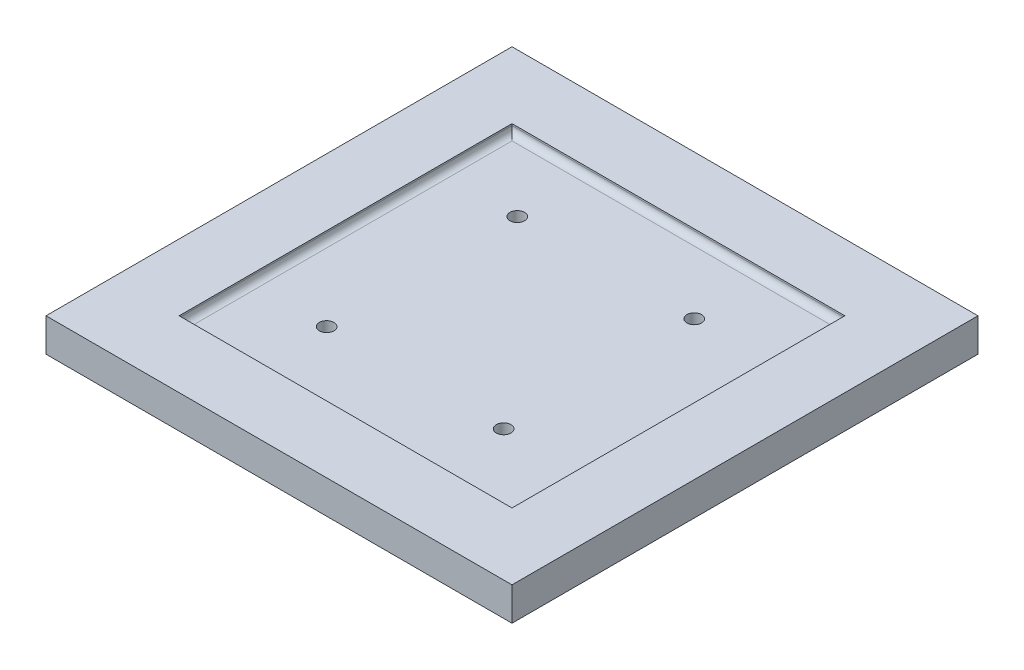
ISO-10303-21;
HEADER;
FILE_DESCRIPTION(('STEP AP214'),'2;1');
FILE_NAME('part.step','',(''),(''),'','','');
FILE_SCHEMA(('AUTOMOTIVE_DESIGN { 1 0 10303 214 1 1 1 1 }'));
ENDSEC;
DATA;
#1=APPLICATION_CONTEXT('core data for automotive mechanical design processes');
#2=APPLICATION_PROTOCOL_DEFINITION('international standard','automotive_design',2000,#1);
#3=PRODUCT_CONTEXT('',#1,'mechanical');
#4=PRODUCT('Part','Part','',(#3));
#5=PRODUCT_RELATED_PRODUCT_CATEGORY('part','',(#4));
#6=PRODUCT_DEFINITION_FORMATION('','',#4);
#7=PRODUCT_DEFINITION_CONTEXT('part definition',#1,'design');
#8=PRODUCT_DEFINITION('design','',#6,#7);
#9=PRODUCT_DEFINITION_SHAPE('','',#8);
#10=(LENGTH_UNIT() NAMED_UNIT(*) SI_UNIT(.MILLI.,.METRE.));
#11=(NAMED_UNIT(*) PLANE_ANGLE_UNIT() SI_UNIT($,.RADIAN.));
#12=(NAMED_UNIT(*) SI_UNIT($,.STERADIAN.) SOLID_ANGLE_UNIT());
#13=UNCERTAINTY_MEASURE_WITH_UNIT(LENGTH_MEASURE(1.E-05),#10,'distance_accuracy_value','');
#14=(GEOMETRIC_REPRESENTATION_CONTEXT(3) GLOBAL_UNCERTAINTY_ASSIGNED_CONTEXT((#13)) GLOBAL_UNIT_ASSIGNED_CONTEXT((#10,
#11,#12)) REPRESENTATION_CONTEXT('',''));
#15=CARTESIAN_POINT('',(0.,0.,0.));
#16=DIRECTION('',(0.,0.,1.));
#17=DIRECTION('',(1.,0.,0.));
#18=AXIS2_PLACEMENT_3D('',#15,#16,#17);
#19=CARTESIAN_POINT('',(88.9,12.7,-88.9));
#20=DIRECTION('',(0.,0.,1.));
#21=DIRECTION('',(1.,0.,0.));
#22=AXIS2_PLACEMENT_3D('',#19,#20,#21);
#23=PLANE('',#22);
#24=DIRECTION('',(-1.,0.,0.));
#25=VECTOR('',#24,1.);
#26=CARTESIAN_POINT('',(88.9,0.,-88.9));
#27=LINE('',#26,#25);
#28=CARTESIAN_POINT('',(88.9,0.,-88.9));
#29=VERTEX_POINT('',#28);
#30=CARTESIAN_POINT('',(-88.9,0.,-88.9));
#31=VERTEX_POINT('',#30);
#32=EDGE_CURVE('E215',#29,#31,#27,.T.);
#33=ORIENTED_EDGE('',*,*,#32,.T.);
#34=DIRECTION('',(0.,-1.,0.));
#35=VECTOR('',#34,1.);
#36=CARTESIAN_POINT('',(-88.9,12.7,-88.9));
#37=LINE('',#36,#35);
#38=CARTESIAN_POINT('',(-88.9,12.7,-88.9));
#39=VERTEX_POINT('',#38);
#40=EDGE_CURVE('E262',#39,#31,#37,.T.);
#41=ORIENTED_EDGE('',*,*,#40,.F.);
#42=DIRECTION('',(-1.,0.,0.));
#43=VECTOR('',#42,1.);
#44=CARTESIAN_POINT('',(88.9,12.7,-88.9));
#45=LINE('',#44,#43);
#46=CARTESIAN_POINT('',(88.9,12.7,-88.9));
#47=VERTEX_POINT('',#46);
#48=EDGE_CURVE('E224',#47,#39,#45,.T.);
#49=ORIENTED_EDGE('',*,*,#48,.F.);
#50=DIRECTION('',(0.,-1.,0.));
#51=VECTOR('',#50,1.);
#52=CARTESIAN_POINT('',(88.9,12.7,-88.9));
#53=LINE('',#52,#51);
#54=EDGE_CURVE('E239',#47,#29,#53,.T.);
#55=ORIENTED_EDGE('',*,*,#54,.T.);
#56=EDGE_LOOP('',(#33,#41,#49,#55));
#57=FACE_BOUND('',#56,.T.);
#58=ADVANCED_FACE('F40',(#57),#23,.F.);
#59=CARTESIAN_POINT('',(-88.9,12.7,88.9));
#60=DIRECTION('',(-1.,0.,0.));
#61=DIRECTION('',(0.,0.,1.));
#62=AXIS2_PLACEMENT_3D('',#59,#60,#61);
#63=PLANE('',#62);
#64=DIRECTION('',(0.,0.,-1.));
#65=VECTOR('',#64,1.);
#66=CARTESIAN_POINT('',(-88.9,0.,88.9));
#67=LINE('',#66,#65);
#68=CARTESIAN_POINT('',(-88.9,0.,88.9));
#69=VERTEX_POINT('',#68);
#70=EDGE_CURVE('E243',#69,#31,#67,.T.);
#71=ORIENTED_EDGE('',*,*,#70,.F.);
#72=DIRECTION('',(0.,-1.,0.));
#73=VECTOR('',#72,1.);
#74=CARTESIAN_POINT('',(-88.9,12.7,88.9));
#75=LINE('',#74,#73);
#76=CARTESIAN_POINT('',(-88.9,12.7,88.9));
#77=VERTEX_POINT('',#76);
#78=EDGE_CURVE('E259',#77,#69,#75,.T.);
#79=ORIENTED_EDGE('',*,*,#78,.F.);
#80=DIRECTION('',(0.,0.,-1.));
#81=VECTOR('',#80,1.);
#82=CARTESIAN_POINT('',(-88.9,12.7,88.9));
#83=LINE('',#82,#81);
#84=EDGE_CURVE('E227',#77,#39,#83,.T.);
#85=ORIENTED_EDGE('',*,*,#84,.T.);
#86=ORIENTED_EDGE('',*,*,#40,.T.);
#87=EDGE_LOOP('',(#71,#79,#85,#86));
#88=FACE_BOUND('',#87,.T.);
#89=ADVANCED_FACE('F394',(#88),#63,.T.);
#90=CARTESIAN_POINT('',(88.9,12.7,88.9));
#91=DIRECTION('',(0.,0.,1.));
#92=DIRECTION('',(1.,0.,0.));
#93=AXIS2_PLACEMENT_3D('',#90,#91,#92);
#94=PLANE('',#93);
#95=DIRECTION('',(-1.,0.,0.));
#96=VECTOR('',#95,1.);
#97=CARTESIAN_POINT('',(88.9,0.,88.9));
#98=LINE('',#97,#96);
#99=CARTESIAN_POINT('',(88.9,0.,88.9));
#100=VERTEX_POINT('',#99);
#101=EDGE_CURVE('E247',#100,#69,#98,.T.);
#102=ORIENTED_EDGE('',*,*,#101,.F.);
#103=DIRECTION('',(0.,-1.,0.));
#104=VECTOR('',#103,1.);
#105=CARTESIAN_POINT('',(88.9,12.7,88.9));
#106=LINE('',#105,#104);
#107=CARTESIAN_POINT('',(88.9,12.7,88.9));
#108=VERTEX_POINT('',#107);
#109=EDGE_CURVE('E256',#108,#100,#106,.T.);
#110=ORIENTED_EDGE('',*,*,#109,.F.);
#111=DIRECTION('',(-1.,0.,0.));
#112=VECTOR('',#111,1.);
#113=CARTESIAN_POINT('',(88.9,12.7,88.9));
#114=LINE('',#113,#112);
#115=EDGE_CURVE('E232',#108,#77,#114,.T.);
#116=ORIENTED_EDGE('',*,*,#115,.T.);
#117=ORIENTED_EDGE('',*,*,#78,.T.);
#118=EDGE_LOOP('',(#102,#110,#116,#117));
#119=FACE_BOUND('',#118,.T.);
#120=ADVANCED_FACE('F400',(#119),#94,.T.);
#121=CARTESIAN_POINT('',(88.9,12.7,88.9));
#122=DIRECTION('',(-1.,0.,0.));
#123=DIRECTION('',(0.,0.,1.));
#124=AXIS2_PLACEMENT_3D('',#121,#122,#123);
#125=PLANE('',#124);
#126=DIRECTION('',(0.,0.,-1.));
#127=VECTOR('',#126,1.);
#128=CARTESIAN_POINT('',(88.9,0.,88.9));
#129=LINE('',#128,#127);
#130=EDGE_CURVE('E228',#100,#29,#129,.T.);
#131=ORIENTED_EDGE('',*,*,#130,.T.);
#132=ORIENTED_EDGE('',*,*,#54,.F.);
#133=DIRECTION('',(0.,0.,-1.));
#134=VECTOR('',#133,1.);
#135=CARTESIAN_POINT('',(88.9,12.7,88.9));
#136=LINE('',#135,#134);
#137=EDGE_CURVE('E236',#108,#47,#136,.T.);
#138=ORIENTED_EDGE('',*,*,#137,.F.);
#139=ORIENTED_EDGE('',*,*,#109,.T.);
#140=EDGE_LOOP('',(#131,#132,#138,#139));
#141=FACE_BOUND('',#140,.T.);
#142=ADVANCED_FACE('F591',(#141),#125,.F.);
#143=CARTESIAN_POINT('',(0.,12.7,0.));
#144=DIRECTION('',(0.,-1.,0.));
#145=DIRECTION('',(0.,0.,-1.));
#146=AXIS2_PLACEMENT_3D('',#143,#144,#145);
#147=PLANE('',#146);
#148=DIRECTION('',(1.,0.,0.));
#149=VECTOR('',#148,1.);
#150=CARTESIAN_POINT('',(63.5,12.7,63.5));
#151=LINE('',#150,#149);
#152=CARTESIAN_POINT('',(-63.5,12.7,63.5));
#153=VERTEX_POINT('',#152);
#154=CARTESIAN_POINT('',(63.5,12.7,63.5));
#155=VERTEX_POINT('',#154);
#156=EDGE_CURVE('E199',#153,#155,#151,.T.);
#157=ORIENTED_EDGE('',*,*,#156,.F.);
#158=DIRECTION('',(0.,0.,1.));
#159=VECTOR('',#158,1.);
#160=CARTESIAN_POINT('',(-63.5,12.7,63.5));
#161=LINE('',#160,#159);
#162=CARTESIAN_POINT('',(-63.5,12.7,-63.5));
#163=VERTEX_POINT('',#162);
#164=EDGE_CURVE('E191',#163,#153,#161,.T.);
#165=ORIENTED_EDGE('',*,*,#164,.F.);
#166=DIRECTION('',(-1.,0.,0.));
#167=VECTOR('',#166,1.);
#168=CARTESIAN_POINT('',(63.5,12.7,-63.5));
#169=LINE('',#168,#167);
#170=CARTESIAN_POINT('',(63.5,12.7,-63.5));
#171=VERTEX_POINT('',#170);
#172=EDGE_CURVE('E207',#171,#163,#169,.T.);
#173=ORIENTED_EDGE('',*,*,#172,.F.);
#174=DIRECTION('',(0.,0.,-1.));
#175=VECTOR('',#174,1.);
#176=CARTESIAN_POINT('',(63.5,12.7,63.5));
#177=LINE('',#176,#175);
#178=EDGE_CURVE('E203',#155,#171,#177,.T.);
#179=ORIENTED_EDGE('',*,*,#178,.F.);
#180=EDGE_LOOP('',(#157,#165,#173,#179));
#181=FACE_BOUND('',#180,.T.);
#182=ORIENTED_EDGE('',*,*,#48,.T.);
#183=ORIENTED_EDGE('',*,*,#84,.F.);
#184=ORIENTED_EDGE('',*,*,#115,.F.);
#185=ORIENTED_EDGE('',*,*,#137,.T.);
#186=EDGE_LOOP('',(#182,#183,#184,#185));
#187=FACE_BOUND('',#186,.T.);
#188=ADVANCED_FACE('F583',(#181,#187),#147,.F.);
#189=CARTESIAN_POINT('',(0.,0.,0.));
#190=DIRECTION('',(0.,-1.,0.));
#191=DIRECTION('',(0.,0.,-1.));
#192=AXIS2_PLACEMENT_3D('',#189,#190,#191);
#193=PLANE('',#192);
#194=DIRECTION('',(0.,0.,1.));
#195=VECTOR('',#194,1.);
#196=CARTESIAN_POINT('',(63.5,0.,63.5));
#197=LINE('',#196,#195);
#198=CARTESIAN_POINT('',(63.5,0.,-63.5));
#199=VERTEX_POINT('',#198);
#200=CARTESIAN_POINT('',(63.5,0.,63.5));
#201=VERTEX_POINT('',#200);
#202=EDGE_CURVE('E176',#199,#201,#197,.T.);
#203=ORIENTED_EDGE('',*,*,#202,.F.);
#204=DIRECTION('',(1.,0.,0.));
#205=VECTOR('',#204,1.);
#206=CARTESIAN_POINT('',(-63.5,0.,-63.5));
#207=LINE('',#206,#205);
#208=CARTESIAN_POINT('',(-63.5,0.,-63.5));
#209=VERTEX_POINT('',#208);
#210=EDGE_CURVE('E181',#209,#199,#207,.T.);
#211=ORIENTED_EDGE('',*,*,#210,.F.);
#212=DIRECTION('',(0.,0.,-1.));
#213=VECTOR('',#212,1.);
#214=CARTESIAN_POINT('',(-63.5,0.,63.5));
#215=LINE('',#214,#213);
#216=CARTESIAN_POINT('',(-63.5,0.,63.5));
#217=VERTEX_POINT('',#216);
#218=EDGE_CURVE('E158',#217,#209,#215,.T.);
#219=ORIENTED_EDGE('',*,*,#218,.F.);
#220=DIRECTION('',(-1.,0.,0.));
#221=VECTOR('',#220,1.);
#222=CARTESIAN_POINT('',(-63.5,0.,63.5));
#223=LINE('',#222,#221);
#224=EDGE_CURVE('E170',#201,#217,#223,.T.);
#225=ORIENTED_EDGE('',*,*,#224,.F.);
#226=EDGE_LOOP('',(#203,#211,#219,#225));
#227=FACE_BOUND('',#226,.T.);
#228=ORIENTED_EDGE('',*,*,#32,.F.);
#229=ORIENTED_EDGE('',*,*,#130,.F.);
#230=ORIENTED_EDGE('',*,*,#101,.T.);
#231=ORIENTED_EDGE('',*,*,#70,.T.);
#232=EDGE_LOOP('',(#228,#229,#230,#231));
#233=FACE_BOUND('',#232,.T.);
#234=ADVANCED_FACE('F178',(#227,#233),#193,.T.);
#235=CARTESIAN_POINT('',(-63.5,9.525,63.5));
#236=DIRECTION('',(-1.,0.,0.));
#237=DIRECTION('',(0.,0.,1.));
#238=AXIS2_PLACEMENT_3D('',#235,#236,#237);
#239=PLANE('',#238);
#240=DIRECTION('',(0.,1.,0.));
#241=VECTOR('',#240,1.);
#242=CARTESIAN_POINT('',(-63.5,9.525,63.5));
#243=LINE('',#242,#241);
#244=CARTESIAN_POINT('',(-63.5,12.065,63.5));
#245=VERTEX_POINT('',#244);
#246=EDGE_CURVE('E211',#245,#153,#243,.T.);
#247=ORIENTED_EDGE('',*,*,#246,.F.);
#248=DIRECTION('',(0.,0.,1.));
#249=VECTOR('',#248,1.);
#250=CARTESIAN_POINT('',(-63.5,12.065,63.5));
#251=LINE('',#250,#249);
#252=CARTESIAN_POINT('',(-63.5,12.065,-63.5));
#253=VERTEX_POINT('',#252);
#254=EDGE_CURVE('E278',#245,#253,#251,.F.);
#255=ORIENTED_EDGE('',*,*,#254,.T.);
#256=DIRECTION('',(0.,1.,0.));
#257=VECTOR('',#256,1.);
#258=CARTESIAN_POINT('',(-63.5,9.525,-63.5));
#259=LINE('',#258,#257);
#260=EDGE_CURVE('E212',#253,#163,#259,.T.);
#261=ORIENTED_EDGE('',*,*,#260,.T.);
#262=ORIENTED_EDGE('',*,*,#164,.T.);
#263=EDGE_LOOP('',(#247,#255,#261,#262));
#264=FACE_BOUND('',#263,.T.);
#265=ADVANCED_FACE('F566',(#264),#239,.F.);
#266=CARTESIAN_POINT('',(63.5,9.525,-63.5));
#267=DIRECTION('',(0.,0.,-1.));
#268=DIRECTION('',(-1.,0.,0.));
#269=AXIS2_PLACEMENT_3D('',#266,#267,#268);
#270=PLANE('',#269);
#271=ORIENTED_EDGE('',*,*,#260,.F.);
#272=DIRECTION('',(-1.,0.,0.));
#273=VECTOR('',#272,1.);
#274=CARTESIAN_POINT('',(63.5,12.065,-63.5));
#275=LINE('',#274,#273);
#276=CARTESIAN_POINT('',(63.5,12.065,-63.5));
#277=VERTEX_POINT('',#276);
#278=EDGE_CURVE('E285',#253,#277,#275,.F.);
#279=ORIENTED_EDGE('',*,*,#278,.T.);
#280=DIRECTION('',(0.,1.,0.));
#281=VECTOR('',#280,1.);
#282=CARTESIAN_POINT('',(63.5,9.525,-63.5));
#283=LINE('',#282,#281);
#284=EDGE_CURVE('E216',#277,#171,#283,.T.);
#285=ORIENTED_EDGE('',*,*,#284,.T.);
#286=ORIENTED_EDGE('',*,*,#172,.T.);
#287=EDGE_LOOP('',(#271,#279,#285,#286));
#288=FACE_BOUND('',#287,.T.);
#289=ADVANCED_FACE('F557',(#288),#270,.F.);
#290=CARTESIAN_POINT('',(63.5,9.525,63.5));
#291=DIRECTION('',(1.,0.,0.));
#292=DIRECTION('',(0.,0.,-1.));
#293=AXIS2_PLACEMENT_3D('',#290,#291,#292);
#294=PLANE('',#293);
#295=ORIENTED_EDGE('',*,*,#284,.F.);
#296=DIRECTION('',(0.,0.,-1.));
#297=VECTOR('',#296,1.);
#298=CARTESIAN_POINT('',(63.5,12.065,63.5));
#299=LINE('',#298,#297);
#300=CARTESIAN_POINT('',(63.5,12.065,63.5));
#301=VERTEX_POINT('',#300);
#302=EDGE_CURVE('E288',#277,#301,#299,.F.);
#303=ORIENTED_EDGE('',*,*,#302,.T.);
#304=DIRECTION('',(0.,1.,0.));
#305=VECTOR('',#304,1.);
#306=CARTESIAN_POINT('',(63.5,9.525,63.5));
#307=LINE('',#306,#305);
#308=EDGE_CURVE('E219',#301,#155,#307,.T.);
#309=ORIENTED_EDGE('',*,*,#308,.T.);
#310=ORIENTED_EDGE('',*,*,#178,.T.);
#311=EDGE_LOOP('',(#295,#303,#309,#310));
#312=FACE_BOUND('',#311,.T.);
#313=ADVANCED_FACE('F548',(#312),#294,.F.);
#314=CARTESIAN_POINT('',(63.5,9.525,63.5));
#315=DIRECTION('',(0.,0.,1.));
#316=DIRECTION('',(1.,0.,0.));
#317=AXIS2_PLACEMENT_3D('',#314,#315,#316);
#318=PLANE('',#317);
#319=ORIENTED_EDGE('',*,*,#308,.F.);
#320=DIRECTION('',(1.,0.,0.));
#321=VECTOR('',#320,1.);
#322=CARTESIAN_POINT('',(63.5,12.065,63.5));
#323=LINE('',#322,#321);
#324=EDGE_CURVE('E282',#301,#245,#323,.F.);
#325=ORIENTED_EDGE('',*,*,#324,.T.);
#326=ORIENTED_EDGE('',*,*,#246,.T.);
#327=ORIENTED_EDGE('',*,*,#156,.T.);
#328=EDGE_LOOP('',(#319,#325,#326,#327));
#329=FACE_BOUND('',#328,.T.);
#330=ADVANCED_FACE('F540',(#329),#318,.F.);
#331=CARTESIAN_POINT('',(0.,9.525,0.));
#332=DIRECTION('',(0.,1.,0.));
#333=DIRECTION('',(0.,0.,1.));
#334=AXIS2_PLACEMENT_3D('',#331,#332,#333);
#335=PLANE('',#334);
#336=CARTESIAN_POINT('',(32.584394023243,9.525,-36.9525917727357));
#337=DIRECTION('',(0.,1.,0.));
#338=DIRECTION('',(0.,0.,1.));
#339=AXIS2_PLACEMENT_3D('',#336,#337,#338);
#340=CIRCLE('',#339,2.794);
#341=CARTESIAN_POINT('',(32.584394023243,9.525,-34.1585917727357));
#342=VERTEX_POINT('',#341);
#343=EDGE_CURVE('E694',#342,#342,#340,.T.);
#344=ORIENTED_EDGE('',*,*,#343,.F.);
#345=EDGE_LOOP('',(#344));
#346=FACE_BOUND('',#345,.T.);
#347=CARTESIAN_POINT('',(-34.9455819959417,9.525,35.7719977863863));
#348=DIRECTION('',(0.,1.,0.));
#349=DIRECTION('',(0.,0.,1.));
#350=AXIS2_PLACEMENT_3D('',#347,#348,#349);
#351=CIRCLE('',#350,2.794);
#352=CARTESIAN_POINT('',(-34.9455819959417,9.525,38.5659977863863));
#353=VERTEX_POINT('',#352);
#354=EDGE_CURVE('E698',#353,#353,#351,.T.);
#355=ORIENTED_EDGE('',*,*,#354,.F.);
#356=EDGE_LOOP('',(#355));
#357=FACE_BOUND('',#356,.T.);
#358=CARTESIAN_POINT('',(32.584394023243,9.525,35.7719977863863));
#359=DIRECTION('',(0.,1.,0.));
#360=DIRECTION('',(0.,0.,1.));
#361=AXIS2_PLACEMENT_3D('',#358,#359,#360);
#362=CIRCLE('',#361,2.794);
#363=CARTESIAN_POINT('',(32.584394023243,9.525,38.5659977863863));
#364=VERTEX_POINT('',#363);
#365=EDGE_CURVE('E702',#364,#364,#362,.T.);
#366=ORIENTED_EDGE('',*,*,#365,.F.);
#367=EDGE_LOOP('',(#366));
#368=FACE_BOUND('',#367,.T.);
#369=CARTESIAN_POINT('',(-34.9455819959417,9.525,-36.9525917727357));
#370=DIRECTION('',(0.,1.,0.));
#371=DIRECTION('',(0.,0.,1.));
#372=AXIS2_PLACEMENT_3D('',#369,#370,#371);
#373=CIRCLE('',#372,2.794);
#374=CARTESIAN_POINT('',(-34.9455819959417,9.525,-34.1585917727357));
#375=VERTEX_POINT('',#374);
#376=EDGE_CURVE('E344',#375,#375,#373,.T.);
#377=ORIENTED_EDGE('',*,*,#376,.F.);
#378=EDGE_LOOP('',(#377));
#379=FACE_BOUND('',#378,.T.);
#380=DIRECTION('',(-1.,0.,0.));
#381=VECTOR('',#380,1.);
#382=CARTESIAN_POINT('',(0.,9.525,-60.96));
#383=LINE('',#382,#381);
#384=CARTESIAN_POINT('',(60.96,9.525,-60.96));
#385=VERTEX_POINT('',#384);
#386=CARTESIAN_POINT('',(-60.96,9.525,-60.96));
#387=VERTEX_POINT('',#386);
#388=EDGE_CURVE('E268',#385,#387,#383,.T.);
#389=ORIENTED_EDGE('',*,*,#388,.T.);
#390=DIRECTION('',(0.,0.,1.));
#391=VECTOR('',#390,1.);
#392=CARTESIAN_POINT('',(-60.96,9.525,0.));
#393=LINE('',#392,#391);
#394=CARTESIAN_POINT('',(-60.96,9.525,60.96));
#395=VERTEX_POINT('',#394);
#396=EDGE_CURVE('E274',#387,#395,#393,.T.);
#397=ORIENTED_EDGE('',*,*,#396,.T.);
#398=DIRECTION('',(1.,0.,0.));
#399=VECTOR('',#398,1.);
#400=CARTESIAN_POINT('',(0.,9.525,60.96));
#401=LINE('',#400,#399);
#402=CARTESIAN_POINT('',(60.96,9.525,60.96));
#403=VERTEX_POINT('',#402);
#404=EDGE_CURVE('E271',#395,#403,#401,.T.);
#405=ORIENTED_EDGE('',*,*,#404,.T.);
#406=DIRECTION('',(0.,0.,-1.));
#407=VECTOR('',#406,1.);
#408=CARTESIAN_POINT('',(60.96,9.525,0.));
#409=LINE('',#408,#407);
#410=EDGE_CURVE('E265',#403,#385,#409,.T.);
#411=ORIENTED_EDGE('',*,*,#410,.T.);
#412=EDGE_LOOP('',(#389,#397,#405,#411));
#413=FACE_BOUND('',#412,.T.);
#414=ADVANCED_FACE('F532',(#346,#357,#368,#379,#413),#335,.T.);
#415=CARTESIAN_POINT('',(63.5,3.175,63.5));
#416=DIRECTION('',(1.,0.,0.));
#417=DIRECTION('',(0.,0.,-1.));
#418=AXIS2_PLACEMENT_3D('',#415,#416,#417);
#419=PLANE('',#418);
#420=DIRECTION('',(0.,-1.,0.));
#421=VECTOR('',#420,1.);
#422=CARTESIAN_POINT('',(63.5,3.175,63.5));
#423=LINE('',#422,#421);
#424=CARTESIAN_POINT('',(63.5,0.635,63.5));
#425=VERTEX_POINT('',#424);
#426=EDGE_CURVE('E167',#425,#201,#423,.T.);
#427=ORIENTED_EDGE('',*,*,#426,.F.);
#428=DIRECTION('',(0.,0.,1.));
#429=VECTOR('',#428,1.);
#430=CARTESIAN_POINT('',(63.5,0.635,63.5));
#431=LINE('',#430,#429);
#432=CARTESIAN_POINT('',(63.5,0.635,-63.5));
#433=VERTEX_POINT('',#432);
#434=EDGE_CURVE('E11',#425,#433,#431,.F.);
#435=ORIENTED_EDGE('',*,*,#434,.T.);
#436=DIRECTION('',(0.,-1.,0.));
#437=VECTOR('',#436,1.);
#438=CARTESIAN_POINT('',(63.5,3.175,-63.5));
#439=LINE('',#438,#437);
#440=EDGE_CURVE('E188',#433,#199,#439,.T.);
#441=ORIENTED_EDGE('',*,*,#440,.T.);
#442=ORIENTED_EDGE('',*,*,#202,.T.);
#443=EDGE_LOOP('',(#427,#435,#441,#442));
#444=FACE_BOUND('',#443,.T.);
#445=ADVANCED_FACE('F524',(#444),#419,.F.);
#446=CARTESIAN_POINT('',(-63.5,3.175,-63.5));
#447=DIRECTION('',(0.,0.,-1.));
#448=DIRECTION('',(-1.,0.,0.));
#449=AXIS2_PLACEMENT_3D('',#446,#447,#448);
#450=PLANE('',#449);
#451=ORIENTED_EDGE('',*,*,#440,.F.);
#452=DIRECTION('',(1.,0.,0.));
#453=VECTOR('',#452,1.);
#454=CARTESIAN_POINT('',(-63.5,0.635,-63.5));
#455=LINE('',#454,#453);
#456=CARTESIAN_POINT('',(-63.5,0.635,-63.5));
#457=VERTEX_POINT('',#456);
#458=EDGE_CURVE('E50',#433,#457,#455,.F.);
#459=ORIENTED_EDGE('',*,*,#458,.T.);
#460=DIRECTION('',(0.,-1.,0.));
#461=VECTOR('',#460,1.);
#462=CARTESIAN_POINT('',(-63.5,3.175,-63.5));
#463=LINE('',#462,#461);
#464=EDGE_CURVE('E166',#457,#209,#463,.T.);
#465=ORIENTED_EDGE('',*,*,#464,.T.);
#466=ORIENTED_EDGE('',*,*,#210,.T.);
#467=EDGE_LOOP('',(#451,#459,#465,#466));
#468=FACE_BOUND('',#467,.T.);
#469=ADVANCED_FACE('F516',(#468),#450,.F.);
#470=CARTESIAN_POINT('',(-63.5,3.175,63.5));
#471=DIRECTION('',(-1.,0.,0.));
#472=DIRECTION('',(0.,0.,1.));
#473=AXIS2_PLACEMENT_3D('',#470,#471,#472);
#474=PLANE('',#473);
#475=ORIENTED_EDGE('',*,*,#464,.F.);
#476=DIRECTION('',(0.,0.,-1.));
#477=VECTOR('',#476,1.);
#478=CARTESIAN_POINT('',(-63.5,0.635,63.5));
#479=LINE('',#478,#477);
#480=CARTESIAN_POINT('',(-63.5,0.635,63.5));
#481=VERTEX_POINT('',#480);
#482=EDGE_CURVE('E161',#457,#481,#479,.F.);
#483=ORIENTED_EDGE('',*,*,#482,.T.);
#484=DIRECTION('',(0.,-1.,0.));
#485=VECTOR('',#484,1.);
#486=CARTESIAN_POINT('',(-63.5,3.175,63.5));
#487=LINE('',#486,#485);
#488=EDGE_CURVE('E154',#481,#217,#487,.T.);
#489=ORIENTED_EDGE('',*,*,#488,.T.);
#490=ORIENTED_EDGE('',*,*,#218,.T.);
#491=EDGE_LOOP('',(#475,#483,#489,#490));
#492=FACE_BOUND('',#491,.T.);
#493=ADVANCED_FACE('F156',(#492),#474,.F.);
#494=CARTESIAN_POINT('',(-63.5,3.175,63.5));
#495=DIRECTION('',(0.,0.,1.));
#496=DIRECTION('',(1.,0.,0.));
#497=AXIS2_PLACEMENT_3D('',#494,#495,#496);
#498=PLANE('',#497);
#499=ORIENTED_EDGE('',*,*,#488,.F.);
#500=DIRECTION('',(-1.,0.,0.));
#501=VECTOR('',#500,1.);
#502=CARTESIAN_POINT('',(-63.5,0.635,63.5));
#503=LINE('',#502,#501);
#504=EDGE_CURVE('E304',#481,#425,#503,.F.);
#505=ORIENTED_EDGE('',*,*,#504,.T.);
#506=ORIENTED_EDGE('',*,*,#426,.T.);
#507=ORIENTED_EDGE('',*,*,#224,.T.);
#508=EDGE_LOOP('',(#499,#505,#506,#507));
#509=FACE_BOUND('',#508,.T.);
#510=ADVANCED_FACE('F171',(#509),#498,.F.);
#511=CARTESIAN_POINT('',(0.,3.175,0.));
#512=DIRECTION('',(0.,-1.,0.));
#513=DIRECTION('',(0.,0.,-1.));
#514=AXIS2_PLACEMENT_3D('',#511,#512,#513);
#515=PLANE('',#514);
#516=CARTESIAN_POINT('',(32.584394023243,3.175,-36.9525917727357));
#517=DIRECTION('',(0.,-1.,0.));
#518=DIRECTION('',(0.,0.,-1.));
#519=AXIS2_PLACEMENT_3D('',#516,#517,#518);
#520=CIRCLE('',#519,2.794);
#521=CARTESIAN_POINT('',(32.584394023243,3.175,-39.7465917727357));
#522=VERTEX_POINT('',#521);
#523=EDGE_CURVE('E44',#522,#522,#520,.T.);
#524=ORIENTED_EDGE('',*,*,#523,.F.);
#525=EDGE_LOOP('',(#524));
#526=FACE_BOUND('',#525,.T.);
#527=CARTESIAN_POINT('',(-34.9455819959417,3.175,35.7719977863863));
#528=DIRECTION('',(0.,-1.,0.));
#529=DIRECTION('',(0.,0.,-1.));
#530=AXIS2_PLACEMENT_3D('',#527,#528,#529);
#531=CIRCLE('',#530,2.794);
#532=CARTESIAN_POINT('',(-34.9455819959417,3.175,32.9779977863863));
#533=VERTEX_POINT('',#532);
#534=EDGE_CURVE('E347',#533,#533,#531,.T.);
#535=ORIENTED_EDGE('',*,*,#534,.F.);
#536=EDGE_LOOP('',(#535));
#537=FACE_BOUND('',#536,.T.);
#538=CARTESIAN_POINT('',(32.584394023243,3.175,35.7719977863863));
#539=DIRECTION('',(0.,-1.,0.));
#540=DIRECTION('',(0.,0.,-1.));
#541=AXIS2_PLACEMENT_3D('',#538,#539,#540);
#542=CIRCLE('',#541,2.794);
#543=CARTESIAN_POINT('',(32.584394023243,3.175,32.9779977863863));
#544=VERTEX_POINT('',#543);
#545=EDGE_CURVE('E343',#544,#544,#542,.T.);
#546=ORIENTED_EDGE('',*,*,#545,.F.);
#547=EDGE_LOOP('',(#546));
#548=FACE_BOUND('',#547,.T.);
#549=CARTESIAN_POINT('',(-34.9455819959417,3.175,-36.9525917727357));
#550=DIRECTION('',(0.,-1.,0.));
#551=DIRECTION('',(0.,0.,-1.));
#552=AXIS2_PLACEMENT_3D('',#549,#550,#551);
#553=CIRCLE('',#552,2.794);
#554=CARTESIAN_POINT('',(-34.9455819959417,3.175,-39.7465917727357));
#555=VERTEX_POINT('',#554);
#556=EDGE_CURVE('E339',#555,#555,#553,.T.);
#557=ORIENTED_EDGE('',*,*,#556,.F.);
#558=EDGE_LOOP('',(#557));
#559=FACE_BOUND('',#558,.T.);
#560=DIRECTION('',(0.,0.,1.));
#561=VECTOR('',#560,1.);
#562=CARTESIAN_POINT('',(60.96,3.175,0.));
#563=LINE('',#562,#561);
#564=CARTESIAN_POINT('',(60.96,3.175,-60.96));
#565=VERTEX_POINT('',#564);
#566=CARTESIAN_POINT('',(60.96,3.175,60.96));
#567=VERTEX_POINT('',#566);
#568=EDGE_CURVE('E291',#565,#567,#563,.T.);
#569=ORIENTED_EDGE('',*,*,#568,.T.);
#570=DIRECTION('',(-1.,0.,0.));
#571=VECTOR('',#570,1.);
#572=CARTESIAN_POINT('',(0.,3.175,60.96));
#573=LINE('',#572,#571);
#574=CARTESIAN_POINT('',(-60.96,3.175,60.96));
#575=VERTEX_POINT('',#574);
#576=EDGE_CURVE('E300',#567,#575,#573,.T.);
#577=ORIENTED_EDGE('',*,*,#576,.T.);
#578=DIRECTION('',(0.,0.,-1.));
#579=VECTOR('',#578,1.);
#580=CARTESIAN_POINT('',(-60.96,3.175,0.));
#581=LINE('',#580,#579);
#582=CARTESIAN_POINT('',(-60.96,3.175,-60.96));
#583=VERTEX_POINT('',#582);
#584=EDGE_CURVE('E297',#575,#583,#581,.T.);
#585=ORIENTED_EDGE('',*,*,#584,.T.);
#586=DIRECTION('',(1.,0.,0.));
#587=VECTOR('',#586,1.);
#588=CARTESIAN_POINT('',(0.,3.175,-60.96));
#589=LINE('',#588,#587);
#590=EDGE_CURVE('E294',#583,#565,#589,.T.);
#591=ORIENTED_EDGE('',*,*,#590,.T.);
#592=EDGE_LOOP('',(#569,#577,#585,#591));
#593=FACE_BOUND('',#592,.T.);
#594=ADVANCED_FACE('F359',(#526,#537,#548,#559,#593),#515,.T.);
#595=CARTESIAN_POINT('',(60.96,12.065,0.));
#596=DIRECTION('',(0.,0.,-1.));
#597=DIRECTION('',(-1.,0.,0.));
#598=AXIS2_PLACEMENT_3D('',#595,#596,#597);
#599=CYLINDRICAL_SURFACE('',#598,2.54);
#600=CARTESIAN_POINT('',(60.96,12.065,60.96));
#601=DIRECTION('',(0.707106781186547,0.,-0.707106781186547));
#602=DIRECTION('',(0.707106781186547,0.,0.707106781186547));
#603=AXIS2_PLACEMENT_3D('',#600,#601,#602);
#604=ELLIPSE('',#603,3.59210244842766,2.54);
#605=EDGE_CURVE('E318',#301,#403,#604,.T.);
#606=ORIENTED_EDGE('',*,*,#605,.F.);
#607=ORIENTED_EDGE('',*,*,#302,.F.);
#608=CARTESIAN_POINT('',(60.96,12.065,-60.96));
#609=DIRECTION('',(-0.707106781186548,0.,-0.707106781186547));
#610=DIRECTION('',(-0.707106781186547,0.,0.707106781186547));
#611=AXIS2_PLACEMENT_3D('',#608,#609,#610);
#612=ELLIPSE('',#611,3.59210244842766,2.54);
#613=EDGE_CURVE('E322',#385,#277,#612,.F.);
#614=ORIENTED_EDGE('',*,*,#613,.F.);
#615=ORIENTED_EDGE('',*,*,#410,.F.);
#616=EDGE_LOOP('',(#606,#607,#614,#615));
#617=FACE_BOUND('',#616,.T.);
#618=ADVANCED_FACE('F362',(#617),#599,.F.);
#619=CARTESIAN_POINT('',(0.,12.065,-60.96));
#620=DIRECTION('',(-1.,0.,0.));
#621=DIRECTION('',(0.,0.,1.));
#622=AXIS2_PLACEMENT_3D('',#619,#620,#621);
#623=CYLINDRICAL_SURFACE('',#622,2.54);
#624=ORIENTED_EDGE('',*,*,#613,.T.);
#625=ORIENTED_EDGE('',*,*,#278,.F.);
#626=CARTESIAN_POINT('',(-60.96,12.065,-60.96));
#627=DIRECTION('',(-0.707106781186547,0.,0.707106781186547));
#628=DIRECTION('',(0.707106781186548,0.,0.707106781186547));
#629=AXIS2_PLACEMENT_3D('',#626,#627,#628);
#630=ELLIPSE('',#629,3.59210244842766,2.54);
#631=EDGE_CURVE('E314',#387,#253,#630,.F.);
#632=ORIENTED_EDGE('',*,*,#631,.F.);
#633=ORIENTED_EDGE('',*,*,#388,.F.);
#634=EDGE_LOOP('',(#624,#625,#632,#633));
#635=FACE_BOUND('',#634,.T.);
#636=ADVANCED_FACE('F407',(#635),#623,.F.);
#637=CARTESIAN_POINT('',(0.,12.065,60.96));
#638=DIRECTION('',(1.,0.,0.));
#639=DIRECTION('',(0.,0.,-1.));
#640=AXIS2_PLACEMENT_3D('',#637,#638,#639);
#641=CYLINDRICAL_SURFACE('',#640,2.54);
#642=ORIENTED_EDGE('',*,*,#605,.T.);
#643=ORIENTED_EDGE('',*,*,#404,.F.);
#644=CARTESIAN_POINT('',(-60.96,12.065,60.96));
#645=DIRECTION('',(0.707106781186547,0.,0.707106781186547));
#646=DIRECTION('',(-0.707106781186547,0.,0.707106781186547));
#647=AXIS2_PLACEMENT_3D('',#644,#645,#646);
#648=ELLIPSE('',#647,3.59210244842766,2.54);
#649=EDGE_CURVE('E311',#245,#395,#648,.T.);
#650=ORIENTED_EDGE('',*,*,#649,.F.);
#651=ORIENTED_EDGE('',*,*,#324,.F.);
#652=EDGE_LOOP('',(#642,#643,#650,#651));
#653=FACE_BOUND('',#652,.T.);
#654=ADVANCED_FACE('F390',(#653),#641,.F.);
#655=CARTESIAN_POINT('',(-60.96,12.065,0.));
#656=DIRECTION('',(0.,0.,1.));
#657=DIRECTION('',(1.,0.,0.));
#658=AXIS2_PLACEMENT_3D('',#655,#656,#657);
#659=CYLINDRICAL_SURFACE('',#658,2.54);
#660=ORIENTED_EDGE('',*,*,#631,.T.);
#661=ORIENTED_EDGE('',*,*,#254,.F.);
#662=ORIENTED_EDGE('',*,*,#649,.T.);
#663=ORIENTED_EDGE('',*,*,#396,.F.);
#664=EDGE_LOOP('',(#660,#661,#662,#663));
#665=FACE_BOUND('',#664,.T.);
#666=ADVANCED_FACE('F385',(#665),#659,.F.);
#667=CARTESIAN_POINT('',(0.,0.635,-60.96));
#668=DIRECTION('',(1.,0.,0.));
#669=DIRECTION('',(0.,0.,-1.));
#670=AXIS2_PLACEMENT_3D('',#667,#668,#669);
#671=CYLINDRICAL_SURFACE('',#670,2.54);
#672=CARTESIAN_POINT('',(-60.96,0.635,-60.96));
#673=DIRECTION('',(0.707106781186548,0.,-0.707106781186547));
#674=DIRECTION('',(-0.707106781186547,0.,-0.707106781186547));
#675=AXIS2_PLACEMENT_3D('',#672,#673,#674);
#676=ELLIPSE('',#675,3.59210244842766,2.54);
#677=EDGE_CURVE('E332',#457,#583,#676,.T.);
#678=ORIENTED_EDGE('',*,*,#677,.F.);
#679=ORIENTED_EDGE('',*,*,#458,.F.);
#680=CARTESIAN_POINT('',(60.96,0.635,-60.96));
#681=DIRECTION('',(0.707106781186547,0.,0.707106781186547));
#682=DIRECTION('',(0.707106781186548,0.,-0.707106781186547));
#683=AXIS2_PLACEMENT_3D('',#680,#681,#682);
#684=ELLIPSE('',#683,3.59210244842766,2.54);
#685=EDGE_CURVE('E315',#565,#433,#684,.F.);
#686=ORIENTED_EDGE('',*,*,#685,.F.);
#687=ORIENTED_EDGE('',*,*,#590,.F.);
#688=EDGE_LOOP('',(#678,#679,#686,#687));
#689=FACE_BOUND('',#688,.T.);
#690=ADVANCED_FACE('F42',(#689),#671,.F.);
#691=CARTESIAN_POINT('',(60.96,0.635,0.));
#692=DIRECTION('',(0.,0.,1.));
#693=DIRECTION('',(1.,0.,0.));
#694=AXIS2_PLACEMENT_3D('',#691,#692,#693);
#695=CYLINDRICAL_SURFACE('',#694,2.54);
#696=ORIENTED_EDGE('',*,*,#685,.T.);
#697=ORIENTED_EDGE('',*,*,#434,.F.);
#698=CARTESIAN_POINT('',(60.96,0.635,60.96));
#699=DIRECTION('',(-0.707106781186548,0.,0.707106781186547));
#700=DIRECTION('',(-0.707106781186547,0.,-0.707106781186548));
#701=AXIS2_PLACEMENT_3D('',#698,#699,#700);
#702=ELLIPSE('',#701,3.59210244842766,2.54);
#703=EDGE_CURVE('E329',#567,#425,#702,.F.);
#704=ORIENTED_EDGE('',*,*,#703,.F.);
#705=ORIENTED_EDGE('',*,*,#568,.F.);
#706=EDGE_LOOP('',(#696,#697,#704,#705));
#707=FACE_BOUND('',#706,.T.);
#708=ADVANCED_FACE('F375',(#707),#695,.F.);
#709=CARTESIAN_POINT('',(-60.96,0.635,0.));
#710=DIRECTION('',(0.,0.,-1.));
#711=DIRECTION('',(-1.,0.,0.));
#712=AXIS2_PLACEMENT_3D('',#709,#710,#711);
#713=CYLINDRICAL_SURFACE('',#712,2.54);
#714=ORIENTED_EDGE('',*,*,#677,.T.);
#715=ORIENTED_EDGE('',*,*,#584,.F.);
#716=CARTESIAN_POINT('',(-60.96,0.635,60.96));
#717=DIRECTION('',(-0.707106781186547,0.,-0.707106781186548));
#718=DIRECTION('',(-0.707106781186548,0.,0.707106781186547));
#719=AXIS2_PLACEMENT_3D('',#716,#717,#718);
#720=ELLIPSE('',#719,3.59210244842766,2.54);
#721=EDGE_CURVE('E326',#481,#575,#720,.T.);
#722=ORIENTED_EDGE('',*,*,#721,.F.);
#723=ORIENTED_EDGE('',*,*,#482,.F.);
#724=EDGE_LOOP('',(#714,#715,#722,#723));
#725=FACE_BOUND('',#724,.T.);
#726=ADVANCED_FACE('F381',(#725),#713,.F.);
#727=CARTESIAN_POINT('',(0.,0.635,60.96));
#728=DIRECTION('',(-1.,0.,0.));
#729=DIRECTION('',(0.,0.,1.));
#730=AXIS2_PLACEMENT_3D('',#727,#728,#729);
#731=CYLINDRICAL_SURFACE('',#730,2.54);
#732=ORIENTED_EDGE('',*,*,#703,.T.);
#733=ORIENTED_EDGE('',*,*,#504,.F.);
#734=ORIENTED_EDGE('',*,*,#721,.T.);
#735=ORIENTED_EDGE('',*,*,#576,.F.);
#736=EDGE_LOOP('',(#732,#733,#734,#735));
#737=FACE_BOUND('',#736,.T.);
#738=ADVANCED_FACE('F377',(#737),#731,.F.);
#739=CARTESIAN_POINT('',(-34.9455819959417,-15.875,-36.9525917727357));
#740=DIRECTION('',(0.,1.,0.));
#741=DIRECTION('',(0.,0.,1.));
#742=AXIS2_PLACEMENT_3D('',#739,#740,#741);
#743=CYLINDRICAL_SURFACE('',#742,2.794);
#744=ORIENTED_EDGE('',*,*,#556,.T.);
#745=EDGE_LOOP('',(#744));
#746=FACE_BOUND('',#745,.T.);
#747=ORIENTED_EDGE('',*,*,#376,.T.);
#748=EDGE_LOOP('',(#747));
#749=FACE_BOUND('',#748,.T.);
#750=ADVANCED_FACE('F417',(#746,#749),#743,.F.);
#751=CARTESIAN_POINT('',(32.584394023243,-15.875,35.7719977863863));
#752=DIRECTION('',(0.,1.,0.));
#753=DIRECTION('',(0.,0.,1.));
#754=AXIS2_PLACEMENT_3D('',#751,#752,#753);
#755=CYLINDRICAL_SURFACE('',#754,2.794);
#756=ORIENTED_EDGE('',*,*,#545,.T.);
#757=EDGE_LOOP('',(#756));
#758=FACE_BOUND('',#757,.T.);
#759=ORIENTED_EDGE('',*,*,#365,.T.);
#760=EDGE_LOOP('',(#759));
#761=FACE_BOUND('',#760,.T.);
#762=ADVANCED_FACE('F434',(#758,#761),#755,.F.);
#763=CARTESIAN_POINT('',(-34.9455819959417,-15.875,35.7719977863863));
#764=DIRECTION('',(0.,1.,0.));
#765=DIRECTION('',(0.,0.,1.));
#766=AXIS2_PLACEMENT_3D('',#763,#764,#765);
#767=CYLINDRICAL_SURFACE('',#766,2.794);
#768=ORIENTED_EDGE('',*,*,#534,.T.);
#769=EDGE_LOOP('',(#768));
#770=FACE_BOUND('',#769,.T.);
#771=ORIENTED_EDGE('',*,*,#354,.T.);
#772=EDGE_LOOP('',(#771));
#773=FACE_BOUND('',#772,.T.);
#774=ADVANCED_FACE('F443',(#770,#773),#767,.F.);
#775=CARTESIAN_POINT('',(32.584394023243,-15.875,-36.9525917727357));
#776=DIRECTION('',(0.,1.,0.));
#777=DIRECTION('',(0.,0.,1.));
#778=AXIS2_PLACEMENT_3D('',#775,#776,#777);
#779=CYLINDRICAL_SURFACE('',#778,2.794);
#780=ORIENTED_EDGE('',*,*,#523,.T.);
#781=EDGE_LOOP('',(#780));
#782=FACE_BOUND('',#781,.T.);
#783=ORIENTED_EDGE('',*,*,#343,.T.);
#784=EDGE_LOOP('',(#783));
#785=FACE_BOUND('',#784,.T.);
#786=ADVANCED_FACE('F356',(#782,#785),#779,.F.);
#787=CLOSED_SHELL('',(#58,#89,#120,#142,#188,#234,#265,#289,#313,#330,#414,#445,#469,#493,#510,
#594,#618,#636,#654,#666,#690,#708,#726,#738,#750,#762,#774,#786));
#788=MANIFOLD_SOLID_BREP('B2',#787);
#789=ADVANCED_BREP_SHAPE_REPRESENTATION('',(#18,#788),#14);
#790=SHAPE_DEFINITION_REPRESENTATION(#9,#789);
ENDSEC;
END-ISO-10303-21;
